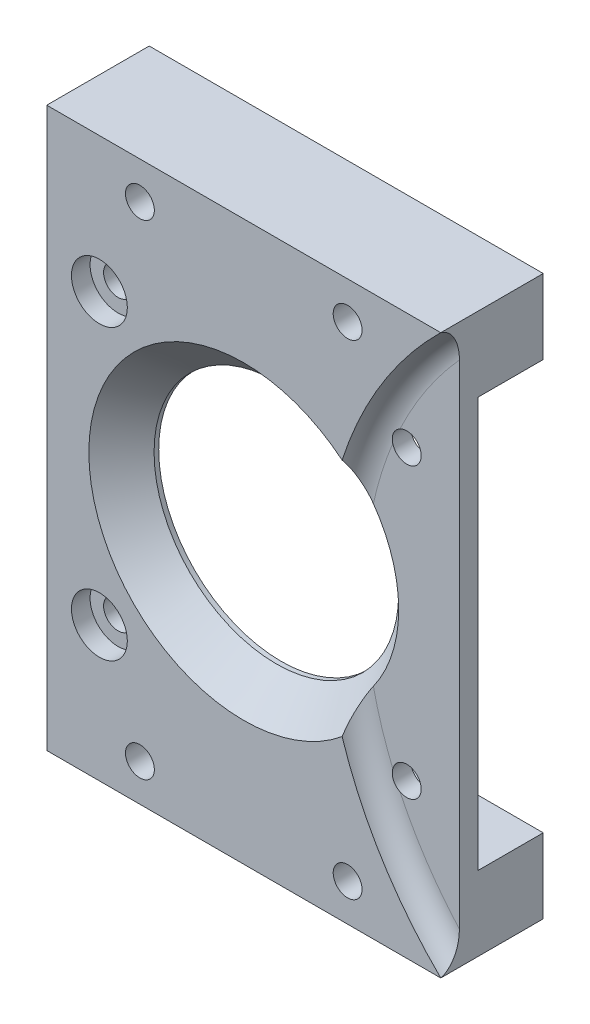
ISO-10303-21;
HEADER;
FILE_DESCRIPTION(('STEP AP214'),'2;1');
FILE_NAME('part.step','',(''),(''),'','','');
FILE_SCHEMA(('AUTOMOTIVE_DESIGN { 1 0 10303 214 1 1 1 1 }'));
ENDSEC;
DATA;
#1=APPLICATION_CONTEXT('core data for automotive mechanical design processes');
#2=APPLICATION_PROTOCOL_DEFINITION('international standard','automotive_design',2000,#1);
#3=PRODUCT_CONTEXT('',#1,'mechanical');
#4=PRODUCT('Part','Part','',(#3));
#5=PRODUCT_RELATED_PRODUCT_CATEGORY('part','',(#4));
#6=PRODUCT_DEFINITION_FORMATION('','',#4);
#7=PRODUCT_DEFINITION_CONTEXT('part definition',#1,'design');
#8=PRODUCT_DEFINITION('design','',#6,#7);
#9=PRODUCT_DEFINITION_SHAPE('','',#8);
#10=(LENGTH_UNIT() NAMED_UNIT(*) SI_UNIT(.MILLI.,.METRE.));
#11=(NAMED_UNIT(*) PLANE_ANGLE_UNIT() SI_UNIT($,.RADIAN.));
#12=(NAMED_UNIT(*) SI_UNIT($,.STERADIAN.) SOLID_ANGLE_UNIT());
#13=UNCERTAINTY_MEASURE_WITH_UNIT(LENGTH_MEASURE(1.E-05),#10,'distance_accuracy_value','');
#14=(GEOMETRIC_REPRESENTATION_CONTEXT(3) GLOBAL_UNCERTAINTY_ASSIGNED_CONTEXT((#13)) GLOBAL_UNIT_ASSIGNED_CONTEXT((#10,
#11,#12)) REPRESENTATION_CONTEXT('',''));
#15=CARTESIAN_POINT('',(0.,0.,0.));
#16=DIRECTION('',(0.,0.,1.));
#17=DIRECTION('',(1.,0.,0.));
#18=AXIS2_PLACEMENT_3D('',#15,#16,#17);
#19=CARTESIAN_POINT('',(0.,0.,4.));
#20=DIRECTION('',(0.,0.,1.));
#21=DIRECTION('',(1.,0.,0.));
#22=AXIS2_PLACEMENT_3D('',#19,#20,#21);
#23=PLANE('',#22);
#24=CARTESIAN_POINT('',(-11.15,26.,4.));
#25=DIRECTION('',(0.,0.,1.));
#26=DIRECTION('',(1.,0.,0.));
#27=AXIS2_PLACEMENT_3D('',#24,#25,#26);
#28=CIRCLE('',#27,1.55);
#29=CARTESIAN_POINT('',(-9.6,26.,4.));
#30=VERTEX_POINT('',#29);
#31=EDGE_CURVE('E438',#30,#30,#28,.F.);
#32=ORIENTED_EDGE('',*,*,#31,.T.);
#33=EDGE_LOOP('',(#32));
#34=FACE_BOUND('',#33,.T.);
#35=CARTESIAN_POINT('',(11.15,-26.,4.));
#36=DIRECTION('',(0.,0.,1.));
#37=DIRECTION('',(1.,0.,0.));
#38=AXIS2_PLACEMENT_3D('',#35,#36,#37);
#39=CIRCLE('',#38,1.55);
#40=CARTESIAN_POINT('',(12.7,-26.,4.));
#41=VERTEX_POINT('',#40);
#42=EDGE_CURVE('E440',#41,#41,#39,.F.);
#43=ORIENTED_EDGE('',*,*,#42,.T.);
#44=EDGE_LOOP('',(#43));
#45=FACE_BOUND('',#44,.T.);
#46=CARTESIAN_POINT('',(-11.15,-26.,4.));
#47=DIRECTION('',(0.,0.,1.));
#48=DIRECTION('',(1.,0.,0.));
#49=AXIS2_PLACEMENT_3D('',#46,#47,#48);
#50=CIRCLE('',#49,1.55);
#51=CARTESIAN_POINT('',(-9.6,-26.,4.));
#52=VERTEX_POINT('',#51);
#53=EDGE_CURVE('E445',#52,#52,#50,.F.);
#54=ORIENTED_EDGE('',*,*,#53,.T.);
#55=EDGE_LOOP('',(#54));
#56=FACE_BOUND('',#55,.T.);
#57=CARTESIAN_POINT('',(11.15,26.,4.));
#58=DIRECTION('',(0.,0.,1.));
#59=DIRECTION('',(1.,0.,0.));
#60=AXIS2_PLACEMENT_3D('',#57,#58,#59);
#61=CIRCLE('',#60,1.55);
#62=CARTESIAN_POINT('',(12.7,26.,4.));
#63=VERTEX_POINT('',#62);
#64=EDGE_CURVE('E439',#63,#63,#61,.F.);
#65=ORIENTED_EDGE('',*,*,#64,.T.);
#66=EDGE_LOOP('',(#65));
#67=FACE_BOUND('',#66,.T.);
#68=CARTESIAN_POINT('',(-15.5000000000036,-15.5000000000003,4.));
#69=DIRECTION('',(0.,0.,1.));
#70=DIRECTION('',(1.,0.,0.));
#71=AXIS2_PLACEMENT_3D('',#68,#69,#70);
#72=CIRCLE('',#71,3.);
#73=CARTESIAN_POINT('',(-12.5000000000036,-15.5000000000003,4.));
#74=VERTEX_POINT('',#73);
#75=EDGE_CURVE('E198',#74,#74,#72,.T.);
#76=ORIENTED_EDGE('',*,*,#75,.F.);
#77=EDGE_LOOP('',(#76));
#78=FACE_BOUND('',#77,.T.);
#79=CARTESIAN_POINT('',(-15.5000000000003,15.5000000000044,4.));
#80=DIRECTION('',(0.,0.,1.));
#81=DIRECTION('',(1.,0.,0.));
#82=AXIS2_PLACEMENT_3D('',#79,#80,#81);
#83=CIRCLE('',#82,3.);
#84=CARTESIAN_POINT('',(-12.5000000000003,15.5000000000044,4.));
#85=VERTEX_POINT('',#84);
#86=EDGE_CURVE('E197',#85,#85,#83,.T.);
#87=ORIENTED_EDGE('',*,*,#86,.F.);
#88=EDGE_LOOP('',(#87));
#89=FACE_BOUND('',#88,.T.);
#90=CARTESIAN_POINT('',(50.5438769133981,0.,4.));
#91=DIRECTION('',(0.,0.,1.));
#92=DIRECTION('',(-1.,0.,0.));
#93=AXIS2_PLACEMENT_3D('',#90,#91,#92);
#94=CIRCLE('',#93,42.);
#95=CARTESIAN_POINT('',(21.15,30.,4.));
#96=VERTEX_POINT('',#95);
#97=CARTESIAN_POINT('',(10.5576465871284,12.8491783509494,4.));
#98=VERTEX_POINT('',#97);
#99=EDGE_CURVE('E214',#96,#98,#94,.T.);
#100=ORIENTED_EDGE('',*,*,#99,.F.);
#101=DIRECTION('',(-1.,0.,0.));
#102=VECTOR('',#101,1.);
#103=CARTESIAN_POINT('',(21.15,30.,4.));
#104=LINE('',#103,#102);
#105=CARTESIAN_POINT('',(-21.15,30.,4.));
#106=VERTEX_POINT('',#105);
#107=EDGE_CURVE('E239',#96,#106,#104,.T.);
#108=ORIENTED_EDGE('',*,*,#107,.T.);
#109=DIRECTION('',(0.,-1.,0.));
#110=VECTOR('',#109,1.);
#111=CARTESIAN_POINT('',(-21.15,-30.,4.));
#112=LINE('',#111,#110);
#113=CARTESIAN_POINT('',(-21.15,-30.,4.));
#114=VERTEX_POINT('',#113);
#115=EDGE_CURVE('E142',#106,#114,#112,.T.);
#116=ORIENTED_EDGE('',*,*,#115,.T.);
#117=DIRECTION('',(1.,0.,0.));
#118=VECTOR('',#117,1.);
#119=CARTESIAN_POINT('',(21.15,-30.,4.));
#120=LINE('',#119,#118);
#121=CARTESIAN_POINT('',(21.15,-30.,4.));
#122=VERTEX_POINT('',#121);
#123=EDGE_CURVE('E242',#114,#122,#120,.T.);
#124=ORIENTED_EDGE('',*,*,#123,.T.);
#125=CARTESIAN_POINT('',(10.5576465871262,-12.8491783509424,4.));
#126=VERTEX_POINT('',#125);
#127=EDGE_CURVE('E217',#126,#122,#94,.T.);
#128=ORIENTED_EDGE('',*,*,#127,.F.);
#129=CARTESIAN_POINT('',(-3.15614118923808E-13,4.44401878829769E-12,4.));
#130=DIRECTION('',(0.,0.,1.));
#131=DIRECTION('',(1.,0.,0.));
#132=AXIS2_PLACEMENT_3D('',#129,#130,#131);
#133=CIRCLE('',#132,16.6302521253619);
#134=EDGE_CURVE('E255',#126,#98,#133,.F.);
#135=ORIENTED_EDGE('',*,*,#134,.T.);
#136=EDGE_LOOP('',(#100,#108,#116,#124,#128,#135));
#137=FACE_BOUND('',#136,.T.);
#138=ADVANCED_FACE('F36',(#34,#45,#56,#67,#78,#89,#137),#23,.T.);
#139=CARTESIAN_POINT('',(0.,0.,0.));
#140=DIRECTION('',(0.,0.,1.));
#141=DIRECTION('',(1.,0.,0.));
#142=AXIS2_PLACEMENT_3D('',#139,#140,#141);
#143=PLANE('',#142);
#144=DIRECTION('',(-1.,0.,0.));
#145=VECTOR('',#144,1.);
#146=CARTESIAN_POINT('',(-21.15,22.,0.));
#147=LINE('',#146,#145);
#148=CARTESIAN_POINT('',(21.15,22.,0.));
#149=VERTEX_POINT('',#148);
#150=CARTESIAN_POINT('',(-21.15,22.,0.));
#151=VERTEX_POINT('',#150);
#152=EDGE_CURVE('E159',#149,#151,#147,.T.);
#153=ORIENTED_EDGE('',*,*,#152,.F.);
#154=DIRECTION('',(0.,1.,0.));
#155=VECTOR('',#154,1.);
#156=CARTESIAN_POINT('',(21.15,-30.,0.));
#157=LINE('',#156,#155);
#158=CARTESIAN_POINT('',(21.15,-22.,0.));
#159=VERTEX_POINT('',#158);
#160=EDGE_CURVE('E238',#159,#149,#157,.T.);
#161=ORIENTED_EDGE('',*,*,#160,.F.);
#162=DIRECTION('',(1.,0.,0.));
#163=VECTOR('',#162,1.);
#164=CARTESIAN_POINT('',(-21.15,-22.,0.));
#165=LINE('',#164,#163);
#166=CARTESIAN_POINT('',(-21.15,-22.,0.));
#167=VERTEX_POINT('',#166);
#168=EDGE_CURVE('E177',#167,#159,#165,.T.);
#169=ORIENTED_EDGE('',*,*,#168,.F.);
#170=DIRECTION('',(0.,-1.,0.));
#171=VECTOR('',#170,1.);
#172=CARTESIAN_POINT('',(-21.15,-30.,0.));
#173=LINE('',#172,#171);
#174=EDGE_CURVE('E62',#151,#167,#173,.T.);
#175=ORIENTED_EDGE('',*,*,#174,.F.);
#176=EDGE_LOOP('',(#153,#161,#169,#175));
#177=FACE_BOUND('',#176,.T.);
#178=CARTESIAN_POINT('',(-3.15614118923808E-13,4.44401878829769E-12,0.));
#179=DIRECTION('',(0.,0.,1.));
#180=DIRECTION('',(1.,0.,0.));
#181=AXIS2_PLACEMENT_3D('',#178,#179,#180);
#182=CIRCLE('',#181,13.1302521253619);
#183=CARTESIAN_POINT('',(13.1302521253616,4.44401878829769E-12,0.));
#184=VERTEX_POINT('',#183);
#185=EDGE_CURVE('E235',#184,#184,#182,.T.);
#186=ORIENTED_EDGE('',*,*,#185,.T.);
#187=EDGE_LOOP('',(#186));
#188=FACE_BOUND('',#187,.T.);
#189=CARTESIAN_POINT('',(-15.5000000000003,15.5000000000044,0.));
#190=DIRECTION('',(0.,0.,1.));
#191=DIRECTION('',(1.,0.,0.));
#192=AXIS2_PLACEMENT_3D('',#189,#190,#191);
#193=CIRCLE('',#192,1.55);
#194=CARTESIAN_POINT('',(-13.9500000000003,15.5000000000044,0.));
#195=VERTEX_POINT('',#194);
#196=EDGE_CURVE('E232',#195,#195,#193,.T.);
#197=ORIENTED_EDGE('',*,*,#196,.T.);
#198=EDGE_LOOP('',(#197));
#199=FACE_BOUND('',#198,.T.);
#200=CARTESIAN_POINT('',(15.5000000000044,15.5000000000012,0.));
#201=DIRECTION('',(0.,0.,1.));
#202=DIRECTION('',(1.,0.,0.));
#203=AXIS2_PLACEMENT_3D('',#200,#201,#202);
#204=CIRCLE('',#203,1.5500000000009);
#205=CARTESIAN_POINT('',(17.0500000000053,15.5000000000012,0.));
#206=VERTEX_POINT('',#205);
#207=EDGE_CURVE('E229',#206,#206,#204,.T.);
#208=ORIENTED_EDGE('',*,*,#207,.T.);
#209=EDGE_LOOP('',(#208));
#210=FACE_BOUND('',#209,.T.);
#211=CARTESIAN_POINT('',(15.5000000000012,-15.5000000000036,0.));
#212=DIRECTION('',(0.,0.,1.));
#213=DIRECTION('',(1.,0.,0.));
#214=AXIS2_PLACEMENT_3D('',#211,#212,#213);
#215=CIRCLE('',#214,1.55000000000123);
#216=CARTESIAN_POINT('',(17.0500000000024,-15.5000000000036,0.));
#217=VERTEX_POINT('',#216);
#218=EDGE_CURVE('E226',#217,#217,#215,.T.);
#219=ORIENTED_EDGE('',*,*,#218,.T.);
#220=EDGE_LOOP('',(#219));
#221=FACE_BOUND('',#220,.T.);
#222=CARTESIAN_POINT('',(-15.5000000000036,-15.5000000000003,0.));
#223=DIRECTION('',(0.,0.,1.));
#224=DIRECTION('',(1.,0.,0.));
#225=AXIS2_PLACEMENT_3D('',#222,#223,#224);
#226=CIRCLE('',#225,1.55000000000047);
#227=CARTESIAN_POINT('',(-13.9500000000031,-15.5000000000003,0.));
#228=VERTEX_POINT('',#227);
#229=EDGE_CURVE('E223',#228,#228,#226,.T.);
#230=ORIENTED_EDGE('',*,*,#229,.T.);
#231=EDGE_LOOP('',(#230));
#232=FACE_BOUND('',#231,.T.);
#233=ADVANCED_FACE('F311',(#177,#188,#199,#210,#221,#232),#143,.F.);
#234=CARTESIAN_POINT('',(21.15,-30.,4.));
#235=DIRECTION('',(-1.,0.,0.));
#236=DIRECTION('',(0.,0.,1.));
#237=AXIS2_PLACEMENT_3D('',#234,#235,#236);
#238=PLANE('',#237);
#239=DIRECTION('',(0.,0.,-1.));
#240=VECTOR('',#239,1.);
#241=CARTESIAN_POINT('',(21.15,30.,4.));
#242=LINE('',#241,#240);
#243=CARTESIAN_POINT('',(21.15,30.,-7.));
#244=VERTEX_POINT('',#243);
#245=EDGE_CURVE('E145',#96,#244,#242,.T.);
#246=ORIENTED_EDGE('',*,*,#245,.F.);
#247=CARTESIAN_POINT('',(21.15,30.,4.));
#248=CARTESIAN_POINT('',(21.15,29.9823229246285,3.93808051762968));
#249=CARTESIAN_POINT('',(21.15,29.9614519797545,3.87711289801731));
#250=CARTESIAN_POINT('',(21.15,29.9138927214578,3.75758819217407));
#251=CARTESIAN_POINT('',(21.15,29.8872129958025,3.69902769756867));
#252=CARTESIAN_POINT('',(21.15,29.8288354675369,3.5851935156425));
#253=CARTESIAN_POINT('',(21.15,29.7971887532433,3.52989349408233));
#254=CARTESIAN_POINT('',(21.15,29.7292500656117,3.42222196069885));
#255=CARTESIAN_POINT('',(21.15,29.6929564438008,3.36985149764476));
#256=CARTESIAN_POINT('',(21.15,29.5783762256451,3.21802631230102));
#257=CARTESIAN_POINT('',(21.15,29.4939943144953,3.12310881008613));
#258=CARTESIAN_POINT('',(21.15,29.3127351838226,2.94589842983991));
#259=CARTESIAN_POINT('',(21.15,29.2158271101888,2.86363786202568));
#260=CARTESIAN_POINT('',(21.15,28.9542880885123,2.66786739355103));
#261=CARTESIAN_POINT('',(21.15,28.7827440665546,2.56356818827994));
#262=CARTESIAN_POINT('',(21.15,28.4248783337179,2.38321884880126));
#263=CARTESIAN_POINT('',(21.15,28.2384942159164,2.30729658348841));
#264=CARTESIAN_POINT('',(21.15,27.9196015228708,2.20207977540903));
#265=CARTESIAN_POINT('',(21.15,27.7893662471128,2.16565453540405));
#266=CARTESIAN_POINT('',(21.15,27.5261982961067,2.10390846617076));
#267=CARTESIAN_POINT('',(21.15,27.3932639005264,2.07859496749764));
#268=CARTESIAN_POINT('',(21.15,27.1275309030053,2.03877827250907));
#269=CARTESIAN_POINT('',(21.15,26.9947518010082,2.02414254928157));
#270=CARTESIAN_POINT('',(21.15,26.7286714674518,2.00477248258794));
#271=CARTESIAN_POINT('',(21.15,26.5953713421445,2.00002306069268));
#272=CARTESIAN_POINT('',(21.15,26.4621023655758,2.));
#273=B_SPLINE_CURVE_WITH_KNOTS('',3,(#247,#248,#249,#250,#251,#252,#253,#254,#255,#256,#257,
#258,#259,#260,#261,#262,#263,#264,#265,#266,#267,#268,#269,#270,#271,#272),.UNSPECIFIED.,.F.,
.F.,(4,2,2,2,2,2,2,2,2,2,2,2,4),(0.,0.193038288369215,0.385793101529734,0.57668158219881,
0.767637968435765,1.14704015775366,1.52739535376786,2.12634464200897,2.72796120765596,
3.13319700009996,3.53869973136802,3.93907973819243,4.33884864304363),.UNSPECIFIED.);
#274=CARTESIAN_POINT('',(21.15,26.4621023655758,2.));
#275=VERTEX_POINT('',#274);
#276=EDGE_CURVE('E331',#96,#275,#273,.T.);
#277=ORIENTED_EDGE('',*,*,#276,.T.);
#278=DIRECTION('',(0.,1.,0.));
#279=VECTOR('',#278,1.);
#280=CARTESIAN_POINT('',(21.15,-30.,2.));
#281=LINE('',#280,#279);
#282=CARTESIAN_POINT('',(21.15,-26.4621023655758,2.));
#283=VERTEX_POINT('',#282);
#284=EDGE_CURVE('E210',#283,#275,#281,.T.);
#285=ORIENTED_EDGE('',*,*,#284,.F.);
#286=CARTESIAN_POINT('',(21.15,-26.4621023655758,2.));
#287=CARTESIAN_POINT('',(21.15,-26.6076180690685,2.00003266519487));
#288=CARTESIAN_POINT('',(21.15,-26.7531827747909,2.00569071000889));
#289=CARTESIAN_POINT('',(21.15,-27.043695277469,2.02882897700386));
#290=CARTESIAN_POINT('',(21.15,-27.1886409101826,2.04633613342165));
#291=CARTESIAN_POINT('',(21.15,-27.4781505052372,2.09401631253907));
#292=CARTESIAN_POINT('',(21.15,-27.6226917244496,2.12432996261918));
#293=CARTESIAN_POINT('',(21.15,-27.9081468204618,2.19839559526637));
#294=CARTESIAN_POINT('',(21.15,-28.0490643872398,2.24213326904247));
#295=CARTESIAN_POINT('',(21.15,-28.358383995256,2.35606798842214));
#296=CARTESIAN_POINT('',(21.15,-28.525416365476,2.43007454178752));
#297=CARTESIAN_POINT('',(21.15,-28.8463548271292,2.60197947684616));
#298=CARTESIAN_POINT('',(21.15,-29.0003000826267,2.699802926));
#299=CARTESIAN_POINT('',(21.15,-29.2559250318991,2.8961066027681));
#300=CARTESIAN_POINT('',(21.15,-29.3615466393766,2.98942337515758));
#301=CARTESIAN_POINT('',(21.15,-29.5564090611133,3.1915458602483));
#302=CARTESIAN_POINT('',(21.15,-29.6457016777984,3.30030057584449));
#303=CARTESIAN_POINT('',(21.15,-29.7845425902232,3.50557085766032));
#304=CARTESIAN_POINT('',(21.15,-29.8385056315661,3.59907568156235));
#305=CARTESIAN_POINT('',(21.15,-29.908070725877,3.74513017524816));
#306=CARTESIAN_POINT('',(21.15,-29.9294210011731,3.79497948606929));
#307=CARTESIAN_POINT('',(21.15,-29.967935470263,3.89632536105212));
#308=CARTESIAN_POINT('',(21.15,-29.9850953648122,3.94782355619028));
#309=CARTESIAN_POINT('',(21.15,-30.,4.));
#310=B_SPLINE_CURVE_WITH_KNOTS('',3,(#286,#287,#288,#289,#290,#291,#292,#293,#294,#295,#296,
#297,#298,#299,#300,#301,#302,#303,#304,#305,#306,#307,#308,#309),.UNSPECIFIED.,.F.,.F.,(4,2,2,
2,2,2,2,2,2,2,2,4),(0.,0.436512043591912,0.874019670831838,1.31646181333594,1.75843398094273,
2.30479602602032,2.84946083361362,3.27080592012575,3.69079021221825,4.013375393582,
4.17589338118165,4.33857741487711),.UNSPECIFIED.);
#311=EDGE_CURVE('E50',#283,#122,#310,.T.);
#312=ORIENTED_EDGE('',*,*,#311,.T.);
#313=DIRECTION('',(0.,0.,-1.));
#314=VECTOR('',#313,1.);
#315=CARTESIAN_POINT('',(21.15,-30.,4.));
#316=LINE('',#315,#314);
#317=CARTESIAN_POINT('',(21.15,-30.,-7.));
#318=VERTEX_POINT('',#317);
#319=EDGE_CURVE('E245',#122,#318,#316,.T.);
#320=ORIENTED_EDGE('',*,*,#319,.T.);
#321=DIRECTION('',(0.,-1.,0.));
#322=VECTOR('',#321,1.);
#323=CARTESIAN_POINT('',(21.15,-30.,-7.));
#324=LINE('',#323,#322);
#325=CARTESIAN_POINT('',(21.15,-22.,-7.));
#326=VERTEX_POINT('',#325);
#327=EDGE_CURVE('E183',#326,#318,#324,.T.);
#328=ORIENTED_EDGE('',*,*,#327,.F.);
#329=DIRECTION('',(0.,0.,1.));
#330=VECTOR('',#329,1.);
#331=CARTESIAN_POINT('',(21.15,-22.,-7.));
#332=LINE('',#331,#330);
#333=EDGE_CURVE('E189',#326,#159,#332,.T.);
#334=ORIENTED_EDGE('',*,*,#333,.T.);
#335=ORIENTED_EDGE('',*,*,#160,.T.);
#336=DIRECTION('',(0.,0.,1.));
#337=VECTOR('',#336,1.);
#338=CARTESIAN_POINT('',(21.15,22.,-7.));
#339=LINE('',#338,#337);
#340=CARTESIAN_POINT('',(21.15,22.,-7.));
#341=VERTEX_POINT('',#340);
#342=EDGE_CURVE('E169',#341,#149,#339,.T.);
#343=ORIENTED_EDGE('',*,*,#342,.F.);
#344=DIRECTION('',(0.,-1.,0.));
#345=VECTOR('',#344,1.);
#346=CARTESIAN_POINT('',(21.15,30.,-7.));
#347=LINE('',#346,#345);
#348=EDGE_CURVE('E153',#244,#341,#347,.T.);
#349=ORIENTED_EDGE('',*,*,#348,.F.);
#350=EDGE_LOOP('',(#246,#277,#285,#312,#320,#328,#334,#335,#343,#349));
#351=FACE_BOUND('',#350,.T.);
#352=ADVANCED_FACE('F315',(#351),#238,.F.);
#353=CARTESIAN_POINT('',(21.15,30.,4.));
#354=DIRECTION('',(0.,-1.,0.));
#355=DIRECTION('',(0.,0.,-1.));
#356=AXIS2_PLACEMENT_3D('',#353,#354,#355);
#357=PLANE('',#356);
#358=ORIENTED_EDGE('',*,*,#245,.T.);
#359=DIRECTION('',(1.,0.,0.));
#360=VECTOR('',#359,1.);
#361=CARTESIAN_POINT('',(-21.15,30.,-7.));
#362=LINE('',#361,#360);
#363=CARTESIAN_POINT('',(-21.15,30.,-7.));
#364=VERTEX_POINT('',#363);
#365=EDGE_CURVE('E149',#364,#244,#362,.T.);
#366=ORIENTED_EDGE('',*,*,#365,.F.);
#367=DIRECTION('',(0.,0.,-1.));
#368=VECTOR('',#367,1.);
#369=CARTESIAN_POINT('',(-21.15,30.,4.));
#370=LINE('',#369,#368);
#371=EDGE_CURVE('E136',#106,#364,#370,.T.);
#372=ORIENTED_EDGE('',*,*,#371,.F.);
#373=ORIENTED_EDGE('',*,*,#107,.F.);
#374=EDGE_LOOP('',(#358,#366,#372,#373));
#375=FACE_BOUND('',#374,.T.);
#376=ADVANCED_FACE('F150',(#375),#357,.F.);
#377=CARTESIAN_POINT('',(-21.15,-30.,4.));
#378=DIRECTION('',(1.,0.,0.));
#379=DIRECTION('',(0.,0.,-1.));
#380=AXIS2_PLACEMENT_3D('',#377,#378,#379);
#381=PLANE('',#380);
#382=ORIENTED_EDGE('',*,*,#371,.T.);
#383=DIRECTION('',(0.,1.,0.));
#384=VECTOR('',#383,1.);
#385=CARTESIAN_POINT('',(-21.15,30.,-7.));
#386=LINE('',#385,#384);
#387=CARTESIAN_POINT('',(-21.15,22.,-7.));
#388=VERTEX_POINT('',#387);
#389=EDGE_CURVE('E140',#388,#364,#386,.T.);
#390=ORIENTED_EDGE('',*,*,#389,.F.);
#391=DIRECTION('',(0.,0.,1.));
#392=VECTOR('',#391,1.);
#393=CARTESIAN_POINT('',(-21.15,22.,-7.));
#394=LINE('',#393,#392);
#395=EDGE_CURVE('E57',#388,#151,#394,.T.);
#396=ORIENTED_EDGE('',*,*,#395,.T.);
#397=ORIENTED_EDGE('',*,*,#174,.T.);
#398=DIRECTION('',(0.,0.,1.));
#399=VECTOR('',#398,1.);
#400=CARTESIAN_POINT('',(-21.15,-22.,-7.));
#401=LINE('',#400,#399);
#402=CARTESIAN_POINT('',(-21.15,-22.,-7.));
#403=VERTEX_POINT('',#402);
#404=EDGE_CURVE('E194',#403,#167,#401,.T.);
#405=ORIENTED_EDGE('',*,*,#404,.F.);
#406=DIRECTION('',(0.,1.,0.));
#407=VECTOR('',#406,1.);
#408=CARTESIAN_POINT('',(-21.15,-30.,-7.));
#409=LINE('',#408,#407);
#410=CARTESIAN_POINT('',(-21.15,-30.,-7.));
#411=VERTEX_POINT('',#410);
#412=EDGE_CURVE('E178',#411,#403,#409,.T.);
#413=ORIENTED_EDGE('',*,*,#412,.F.);
#414=DIRECTION('',(0.,0.,-1.));
#415=VECTOR('',#414,1.);
#416=CARTESIAN_POINT('',(-21.15,-30.,4.));
#417=LINE('',#416,#415);
#418=EDGE_CURVE('E146',#114,#411,#417,.T.);
#419=ORIENTED_EDGE('',*,*,#418,.F.);
#420=ORIENTED_EDGE('',*,*,#115,.F.);
#421=EDGE_LOOP('',(#382,#390,#396,#397,#405,#413,#419,#420));
#422=FACE_BOUND('',#421,.T.);
#423=ADVANCED_FACE('F138',(#422),#381,.F.);
#424=CARTESIAN_POINT('',(21.15,-30.,4.));
#425=DIRECTION('',(0.,1.,0.));
#426=DIRECTION('',(0.,0.,1.));
#427=AXIS2_PLACEMENT_3D('',#424,#425,#426);
#428=PLANE('',#427);
#429=ORIENTED_EDGE('',*,*,#418,.T.);
#430=DIRECTION('',(-1.,0.,0.));
#431=VECTOR('',#430,1.);
#432=CARTESIAN_POINT('',(-21.15,-30.,-7.));
#433=LINE('',#432,#431);
#434=EDGE_CURVE('E186',#318,#411,#433,.T.);
#435=ORIENTED_EDGE('',*,*,#434,.F.);
#436=ORIENTED_EDGE('',*,*,#319,.F.);
#437=ORIENTED_EDGE('',*,*,#123,.F.);
#438=EDGE_LOOP('',(#429,#435,#436,#437));
#439=FACE_BOUND('',#438,.T.);
#440=ADVANCED_FACE('F307',(#439),#428,.F.);
#441=CARTESIAN_POINT('',(-3.15614118923808E-13,4.44401878829769E-12,4.));
#442=DIRECTION('',(0.,0.,-1.));
#443=DIRECTION('',(-1.,0.,0.));
#444=AXIS2_PLACEMENT_3D('',#441,#442,#443);
#445=CYLINDRICAL_SURFACE('',#444,13.1302521253619);
#446=CARTESIAN_POINT('',(-3.15614118923808E-13,4.44401878829769E-12,0.500000000000023));
#447=DIRECTION('',(0.,0.,1.));
#448=DIRECTION('',(1.,0.,0.));
#449=AXIS2_PLACEMENT_3D('',#446,#447,#448);
#450=CIRCLE('',#449,13.1302521253619);
#451=CARTESIAN_POINT('',(13.1302521253616,4.44401878829769E-12,0.500000000000023));
#452=VERTEX_POINT('',#451);
#453=EDGE_CURVE('E252',#452,#452,#450,.T.);
#454=ORIENTED_EDGE('',*,*,#453,.T.);
#455=EDGE_LOOP('',(#454));
#456=FACE_BOUND('',#455,.T.);
#457=ORIENTED_EDGE('',*,*,#185,.F.);
#458=EDGE_LOOP('',(#457));
#459=FACE_BOUND('',#458,.T.);
#460=ADVANCED_FACE('F303',(#456,#459),#445,.F.);
#461=CARTESIAN_POINT('',(-15.5000000000003,15.5000000000044,4.));
#462=DIRECTION('',(0.,0.,-1.));
#463=DIRECTION('',(-1.,0.,0.));
#464=AXIS2_PLACEMENT_3D('',#461,#462,#463);
#465=CYLINDRICAL_SURFACE('',#464,1.55);
#466=CARTESIAN_POINT('',(-15.5000000000003,15.5000000000044,2.));
#467=DIRECTION('',(0.,0.,-1.));
#468=DIRECTION('',(-1.,0.,0.));
#469=AXIS2_PLACEMENT_3D('',#466,#467,#468);
#470=CIRCLE('',#469,1.55);
#471=CARTESIAN_POINT('',(-17.0500000000003,15.5000000000044,2.));
#472=VERTEX_POINT('',#471);
#473=EDGE_CURVE('E264',#472,#472,#470,.T.);
#474=ORIENTED_EDGE('',*,*,#473,.F.);
#475=EDGE_LOOP('',(#474));
#476=FACE_BOUND('',#475,.T.);
#477=ORIENTED_EDGE('',*,*,#196,.F.);
#478=EDGE_LOOP('',(#477));
#479=FACE_BOUND('',#478,.T.);
#480=ADVANCED_FACE('F297',(#476,#479),#465,.F.);
#481=CARTESIAN_POINT('',(15.5000000000044,15.5000000000012,4.));
#482=DIRECTION('',(0.,0.,-1.));
#483=DIRECTION('',(-1.,0.,0.));
#484=AXIS2_PLACEMENT_3D('',#481,#482,#483);
#485=CYLINDRICAL_SURFACE('',#484,1.5500000000009);
#486=CARTESIAN_POINT('',(15.5000000000044,15.5000000000012,2.));
#487=DIRECTION('',(0.,0.,-1.));
#488=DIRECTION('',(-1.,0.,0.));
#489=AXIS2_PLACEMENT_3D('',#486,#487,#488);
#490=CIRCLE('',#489,1.5500000000009);
#491=CARTESIAN_POINT('',(14.7706412374714,16.8676753253321,2.));
#492=VERTEX_POINT('',#491);
#493=CARTESIAN_POINT('',(13.9974251984287,15.1195148285789,2.));
#494=VERTEX_POINT('',#493);
#495=EDGE_CURVE('E220',#492,#494,#490,.T.);
#496=ORIENTED_EDGE('',*,*,#495,.F.);
#497=CARTESIAN_POINT('',(14.7706412374714,16.8676753253321,2.));
#498=CARTESIAN_POINT('',(14.73222892417,16.8471905843288,2.00000214555736));
#499=CARTESIAN_POINT('',(14.6947017538101,16.8250983683323,2.00040542377009));
#500=CARTESIAN_POINT('',(14.6216485110969,16.7778468037872,2.00176403021501));
#501=CARTESIAN_POINT('',(14.5861221469828,16.7526879041293,2.0027192777282));
#502=CARTESIAN_POINT('',(14.4829441643348,16.6728774919028,2.00603573336363));
#503=CARTESIAN_POINT('',(14.4186142998448,16.6138498385378,2.00884868103709));
#504=CARTESIAN_POINT('',(14.3007631081184,16.4858550448829,2.01402312565361));
#505=CARTESIAN_POINT('',(14.2472442402507,16.4168856490699,2.01638451986729));
#506=CARTESIAN_POINT('',(14.1525283682417,16.2709583962913,2.01958324238614));
#507=CARTESIAN_POINT('',(14.1113240220957,16.194005336262,2.02042148032844));
#508=CARTESIAN_POINT('',(14.042470571497,16.0344550068408,2.02022816245634));
#509=CARTESIAN_POINT('',(14.0147929530364,15.9518700321131,2.01920056154912));
#510=CARTESIAN_POINT('',(13.9736249794881,15.7832309514423,2.01570969016568));
#511=CARTESIAN_POINT('',(13.9601419478425,15.6971750785004,2.01324567961725));
#512=CARTESIAN_POINT('',(13.948063943968,15.5282757360444,2.00814464762058));
#513=CARTESIAN_POINT('',(13.9487678512213,15.4454830178141,2.0055221415883));
#514=CARTESIAN_POINT('',(13.9596743588951,15.3222244099437,2.00246936442408));
#515=CARTESIAN_POINT('',(13.9649541800065,15.2812832000955,2.00159849522023));
#516=CARTESIAN_POINT('',(13.9787624130581,15.1999377177035,2.00036466120469));
#517=CARTESIAN_POINT('',(13.9872913862843,15.1595335391797,2.00000178419851));
#518=CARTESIAN_POINT('',(13.9974251984287,15.1195148285789,2.));
#519=B_SPLINE_CURVE_WITH_KNOTS('',3,(#497,#498,#499,#500,#501,#502,#503,#504,#505,#506,#507,
#508,#509,#510,#511,#512,#513,#514,#515,#516,#517,#518),.UNSPECIFIED.,.F.,.F.,(4,2,2,2,2,2,2,2,
2,2,4),(0.,0.130512196916279,0.261005312790058,0.52172503087405,0.782503992859677,
1.04312716499407,1.30319855450854,1.56340405752658,1.81078316484203,1.93453440522508,
2.05830703314257),.UNSPECIFIED.);
#520=EDGE_CURVE('E276',#492,#494,#519,.T.);
#521=ORIENTED_EDGE('',*,*,#520,.T.);
#522=EDGE_LOOP('',(#496,#521));
#523=FACE_BOUND('',#522,.T.);
#524=ORIENTED_EDGE('',*,*,#207,.F.);
#525=EDGE_LOOP('',(#524));
#526=FACE_BOUND('',#525,.T.);
#527=ADVANCED_FACE('F291',(#523,#526),#485,.F.);
#528=CARTESIAN_POINT('',(15.5000000000012,-15.5000000000036,4.));
#529=DIRECTION('',(0.,0.,-1.));
#530=DIRECTION('',(-1.,0.,0.));
#531=AXIS2_PLACEMENT_3D('',#528,#529,#530);
#532=CYLINDRICAL_SURFACE('',#531,1.55000000000123);
#533=CARTESIAN_POINT('',(15.5000000000012,-15.5000000000036,2.));
#534=DIRECTION('',(0.,0.,-1.));
#535=DIRECTION('',(-1.,0.,0.));
#536=AXIS2_PLACEMENT_3D('',#533,#534,#535);
#537=CIRCLE('',#536,1.55000000000123);
#538=CARTESIAN_POINT('',(13.9974251984268,-15.1195148285744,2.));
#539=VERTEX_POINT('',#538);
#540=CARTESIAN_POINT('',(14.7706412374743,-16.8676753253381,2.));
#541=VERTEX_POINT('',#540);
#542=EDGE_CURVE('E213',#539,#541,#537,.T.);
#543=ORIENTED_EDGE('',*,*,#542,.F.);
#544=CARTESIAN_POINT('',(13.9974251984268,-15.1195148285744,2.));
#545=CARTESIAN_POINT('',(13.9867390155356,-15.16171596508,2.00000214555736));
#546=CARTESIAN_POINT('',(13.9778376314303,-15.2043436542488,2.0004054237701));
#547=CARTESIAN_POINT('',(13.96365037617,-15.290181923168,2.00176403021504));
#548=CARTESIAN_POINT('',(13.9583639766129,-15.333392416788,2.00271927772824));
#549=CARTESIAN_POINT('',(13.9479992551531,-15.463423069144,2.00603573336372));
#550=CARTESIAN_POINT('',(13.9483934141025,-15.5507296551832,2.00884868103723));
#551=CARTESIAN_POINT('',(13.9638071130403,-15.7240328244536,2.01402312565386));
#552=CARTESIAN_POINT('',(13.9788299763651,-15.810029105502,2.01638451986762));
#553=CARTESIAN_POINT('',(14.0230756889451,-15.9782794440819,2.01958324238659));
#554=CARTESIAN_POINT('',(14.05229004974,-16.0605357065337,2.02042148032895));
#555=CARTESIAN_POINT('',(14.1240140911739,-16.2188163659908,2.02022816245694));
#556=CARTESIAN_POINT('',(14.1664954924583,-16.2948535881871,2.01920056154976));
#557=CARTESIAN_POINT('',(14.2635695482972,-16.4387652599118,2.01570969016634));
#558=CARTESIAN_POINT('',(14.3181684370807,-16.5066354798447,2.0132456796179));
#559=CARTESIAN_POINT('',(14.4350055028565,-16.6291996104923,2.00814464762108));
#560=CARTESIAN_POINT('',(14.4967344477478,-16.6843781121064,2.00552214158865));
#561=CARTESIAN_POINT('',(14.595266525507,-16.7592317424601,2.00246936442425));
#562=CARTESIAN_POINT('',(14.629109501595,-16.7828688350141,2.00159849522034));
#563=CARTESIAN_POINT('',(14.698583701916,-16.8273782755379,2.00036466120471));
#564=CARTESIAN_POINT('',(14.7342152341954,-16.8482501449797,2.00000178419851));
#565=CARTESIAN_POINT('',(14.7706412374743,-16.8676753253381,2.));
#566=B_SPLINE_CURVE_WITH_KNOTS('',3,(#544,#545,#546,#547,#548,#549,#550,#551,#552,#553,#554,
#555,#556,#557,#558,#559,#560,#561,#562,#563,#564,#565),.UNSPECIFIED.,.F.,.F.,(4,2,2,2,2,2,2,2,
2,2,4),(0.,0.130512196916296,0.261005312790095,0.521725030874131,0.7825039928598,
1.04312716499423,1.30319855450875,1.56340405752684,1.81078316484937,1.93453440523599,
2.05830703315705),.UNSPECIFIED.);
#567=EDGE_CURVE('E342',#539,#541,#566,.T.);
#568=ORIENTED_EDGE('',*,*,#567,.T.);
#569=EDGE_LOOP('',(#543,#568));
#570=FACE_BOUND('',#569,.T.);
#571=ORIENTED_EDGE('',*,*,#218,.F.);
#572=EDGE_LOOP('',(#571));
#573=FACE_BOUND('',#572,.T.);
#574=ADVANCED_FACE('F296',(#570,#573),#532,.F.);
#575=CARTESIAN_POINT('',(-15.5000000000036,-15.5000000000003,4.));
#576=DIRECTION('',(0.,0.,-1.));
#577=DIRECTION('',(-1.,0.,0.));
#578=AXIS2_PLACEMENT_3D('',#575,#576,#577);
#579=CYLINDRICAL_SURFACE('',#578,1.55000000000047);
#580=CARTESIAN_POINT('',(-15.5000000000036,-15.5000000000003,2.));
#581=DIRECTION('',(0.,0.,-1.));
#582=DIRECTION('',(-1.,0.,0.));
#583=AXIS2_PLACEMENT_3D('',#580,#581,#582);
#584=CIRCLE('',#583,1.55000000000047);
#585=CARTESIAN_POINT('',(-17.050000000004,-15.5000000000003,2.));
#586=VERTEX_POINT('',#585);
#587=EDGE_CURVE('E205',#586,#586,#584,.T.);
#588=ORIENTED_EDGE('',*,*,#587,.F.);
#589=EDGE_LOOP('',(#588));
#590=FACE_BOUND('',#589,.T.);
#591=ORIENTED_EDGE('',*,*,#229,.F.);
#592=EDGE_LOOP('',(#591));
#593=FACE_BOUND('',#592,.T.);
#594=ADVANCED_FACE('F374',(#590,#593),#579,.F.);
#595=CARTESIAN_POINT('',(-3.15614118923808E-13,4.44401878829769E-12,0.500000000000023));
#596=DIRECTION('',(0.,0.,1.));
#597=DIRECTION('',(1.,0.,0.));
#598=AXIS2_PLACEMENT_3D('',#595,#596,#597);
#599=CONICAL_SURFACE('',#598,13.1302521253619,0.78539816339745);
#600=CARTESIAN_POINT('',(-3.15614118923808E-13,4.44401878829769E-12,2.));
#601=DIRECTION('',(0.,0.,-1.));
#602=DIRECTION('',(-1.,0.,0.));
#603=AXIS2_PLACEMENT_3D('',#600,#601,#602);
#604=CIRCLE('',#603,14.6302521253619);
#605=CARTESIAN_POINT('',(11.9152406051678,8.48948282127266,2.));
#606=VERTEX_POINT('',#605);
#607=CARTESIAN_POINT('',(11.9152406051663,-8.48948282126587,2.));
#608=VERTEX_POINT('',#607);
#609=EDGE_CURVE('E258',#606,#608,#604,.T.);
#610=ORIENTED_EDGE('',*,*,#609,.F.);
#611=CARTESIAN_POINT('',(11.9152406051678,8.48948282127267,2.));
#612=CARTESIAN_POINT('',(11.853809725817,8.57577565845728,2.0000323742198));
#613=CARTESIAN_POINT('',(11.7944259237381,8.66344182176396,2.00369881801794));
#614=CARTESIAN_POINT('',(11.6796798436123,8.84072034179378,2.01769124228656));
#615=CARTESIAN_POINT('',(11.6243131117973,8.93033039549944,2.0280097180584));
#616=CARTESIAN_POINT('',(11.5175366589241,9.11064743816656,2.05466397780486));
#617=CARTESIAN_POINT('',(11.4661165537688,9.20135076720023,2.0709832674296));
#618=CARTESIAN_POINT('',(11.3670304346075,9.38365244519216,2.1092146773446));
#619=CARTESIAN_POINT('',(11.3193662606719,9.47525120843524,2.13112951693465));
#620=CARTESIAN_POINT('',(11.1400402509102,9.83501645961038,2.22720051678089));
#621=CARTESIAN_POINT('',(11.0224005633894,10.1052511341602,2.32100565006137));
#622=CARTESIAN_POINT('',(10.8214958531568,10.643801469548,2.54620144740637));
#623=CARTESIAN_POINT('',(10.7383560064309,10.9121067303825,2.67772610157769));
#624=CARTESIAN_POINT('',(10.6390887366916,11.3233224159919,2.90653022480004));
#625=CARTESIAN_POINT('',(10.6095919746134,11.4691103573774,2.9931557225351));
#626=CARTESIAN_POINT('',(10.563264521012,11.7573213751649,3.17494138279552));
#627=CARTESIAN_POINT('',(10.5464298760139,11.8997454883865,3.27009887099511));
#628=CARTESIAN_POINT('',(10.5261389774817,12.179793937611,3.46748084028284));
#629=CARTESIAN_POINT('',(10.5226324369225,12.3174343697452,3.56967727361104));
#630=CARTESIAN_POINT('',(10.5295312117045,12.5874932936724,3.78038449787162));
#631=CARTESIAN_POINT('',(10.5399409889698,12.7199100966209,3.8888973033218));
#632=CARTESIAN_POINT('',(10.5576465871284,12.8491783509494,3.99999999999997));
#633=B_SPLINE_CURVE_WITH_KNOTS('',3,(#611,#612,#613,#614,#615,#616,#617,#618,#619,#620,#621,
#622,#623,#624,#625,#626,#627,#628,#629,#630,#631,#632),.UNSPECIFIED.,.F.,.F.,(4,2,2,2,2,2,2,2,
2,2,4),(0.,0.317586100213533,0.634814531237188,0.951177440716484,1.26769438839659,
2.19060588086676,3.11683730205308,3.6326018360215,4.14820526662547,4.66186137983331,
5.17568222371221),.UNSPECIFIED.);
#634=EDGE_CURVE('E283',#606,#98,#633,.T.);
#635=ORIENTED_EDGE('',*,*,#634,.T.);
#636=ORIENTED_EDGE('',*,*,#134,.F.);
#637=CARTESIAN_POINT('',(10.5576465871262,-12.8491783509424,4.));
#638=CARTESIAN_POINT('',(10.5417785727019,-12.7332551785608,3.90036983149892));
#639=CARTESIAN_POINT('',(10.5317660012178,-12.6148484742246,3.80285636143211));
#640=CARTESIAN_POINT('',(10.5229870042581,-12.3737553276359,3.61282252092458));
#641=CARTESIAN_POINT('',(10.5242164685021,-12.251070465893,3.52030033802846));
#642=CARTESIAN_POINT('',(10.5440946804124,-11.8768569666016,3.2507899451986));
#643=CARTESIAN_POINT('',(10.5790103134232,-11.6197731947585,3.08237868312652));
#644=CARTESIAN_POINT('',(10.6887671687025,-11.0940044389515,2.77357652206203));
#645=CARTESIAN_POINT('',(10.7640174619094,-10.825226988989,2.63349333801688));
#646=CARTESIAN_POINT('',(10.9505733466586,-10.2840866387936,2.39010010547404));
#647=CARTESIAN_POINT('',(11.0617815582865,-10.0117353071639,2.28669230240473));
#648=CARTESIAN_POINT('',(11.2395531577538,-9.63432614444115,2.17295074608155));
#649=CARTESIAN_POINT('',(11.2922884348982,-9.52798373061464,2.14420466563));
#650=CARTESIAN_POINT('',(11.4027898540148,-9.31623735199449,2.09395625172457));
#651=CARTESIAN_POINT('',(11.4605533137472,-9.21083291952104,2.07245008564473));
#652=CARTESIAN_POINT('',(11.581334669826,-9.0012477672843,2.03724288198701));
#653=CARTESIAN_POINT('',(11.644368868964,-8.89707207390268,2.02356717130698));
#654=CARTESIAN_POINT('',(11.7428713814297,-8.74265707284421,2.00960315553671));
#655=CARTESIAN_POINT('',(11.7763908402426,-8.69145561060537,2.00603986537319));
#656=CARTESIAN_POINT('',(11.8447879260598,-8.58983767795282,2.00123994815373));
#657=CARTESIAN_POINT('',(11.8796659343167,-8.53942143353458,2.00000397909103));
#658=CARTESIAN_POINT('',(11.915240605166,-8.48948282126581,1.99999999999966));
#659=B_SPLINE_CURVE_WITH_KNOTS('',3,(#637,#638,#639,#640,#641,#642,#643,#644,#645,#646,#647,
#648,#649,#650,#651,#652,#653,#654,#655,#656,#657,#658),.UNSPECIFIED.,.F.,.F.,(4,2,2,2,2,2,2,2,
2,2,4),(0.,0.460692097131034,0.921215764092288,1.84463642613737,2.77760463060303,
3.70806707483409,4.07422345483778,4.44018569506567,4.80732501607385,4.99117196764001,
5.17507088964536),.UNSPECIFIED.);
#660=EDGE_CURVE('E12',#126,#608,#659,.T.);
#661=ORIENTED_EDGE('',*,*,#660,.T.);
#662=EDGE_LOOP('',(#610,#635,#636,#661));
#663=FACE_BOUND('',#662,.T.);
#664=ORIENTED_EDGE('',*,*,#453,.F.);
#665=EDGE_LOOP('',(#664));
#666=FACE_BOUND('',#665,.T.);
#667=ADVANCED_FACE('F328',(#663,#666),#599,.F.);
#668=CARTESIAN_POINT('',(50.5438769133981,0.,2.));
#669=DIRECTION('',(0.,0.,-1.));
#670=DIRECTION('',(-1.,0.,0.));
#671=AXIS2_PLACEMENT_3D('',#668,#669,#670);
#672=PLANE('',#671);
#673=ORIENTED_EDGE('',*,*,#284,.T.);
#674=CARTESIAN_POINT('',(50.5438769133981,0.,2.));
#675=DIRECTION('',(0.,0.,-1.));
#676=DIRECTION('',(-1.,0.,0.));
#677=AXIS2_PLACEMENT_3D('',#674,#675,#676);
#678=CIRCLE('',#677,39.5505102572168);
#679=EDGE_CURVE('E273',#275,#492,#678,.F.);
#680=ORIENTED_EDGE('',*,*,#679,.T.);
#681=ORIENTED_EDGE('',*,*,#495,.T.);
#682=CARTESIAN_POINT('',(50.5438769133981,0.,2.));
#683=DIRECTION('',(0.,0.,-1.));
#684=DIRECTION('',(-1.,0.,0.));
#685=AXIS2_PLACEMENT_3D('',#682,#683,#684);
#686=CIRCLE('',#685,39.5505102572168);
#687=EDGE_CURVE('E271',#494,#606,#686,.F.);
#688=ORIENTED_EDGE('',*,*,#687,.T.);
#689=ORIENTED_EDGE('',*,*,#609,.T.);
#690=CARTESIAN_POINT('',(50.5438769133981,0.,2.));
#691=DIRECTION('',(0.,0.,-1.));
#692=DIRECTION('',(-1.,0.,0.));
#693=AXIS2_PLACEMENT_3D('',#690,#691,#692);
#694=CIRCLE('',#693,39.5505102572168);
#695=EDGE_CURVE('E268',#608,#539,#694,.F.);
#696=ORIENTED_EDGE('',*,*,#695,.T.);
#697=ORIENTED_EDGE('',*,*,#542,.T.);
#698=CARTESIAN_POINT('',(50.5438769133981,0.,2.));
#699=DIRECTION('',(0.,0.,-1.));
#700=DIRECTION('',(-1.,0.,0.));
#701=AXIS2_PLACEMENT_3D('',#698,#699,#700);
#702=CIRCLE('',#701,39.5505102572168);
#703=EDGE_CURVE('E261',#541,#283,#702,.F.);
#704=ORIENTED_EDGE('',*,*,#703,.T.);
#705=EDGE_LOOP('',(#673,#680,#681,#688,#689,#696,#697,#704));
#706=FACE_BOUND('',#705,.T.);
#707=ADVANCED_FACE('F365',(#706),#672,.F.);
#708=CARTESIAN_POINT('',(50.5438769133981,0.,2.));
#709=DIRECTION('',(0.,0.,-1.));
#710=DIRECTION('',(-1.,0.,0.));
#711=AXIS2_PLACEMENT_3D('',#708,#709,#710);
#712=PLANE('',#711);
#713=ORIENTED_EDGE('',*,*,#587,.T.);
#714=EDGE_LOOP('',(#713));
#715=FACE_BOUND('',#714,.T.);
#716=CARTESIAN_POINT('',(-15.5000000000036,-15.5000000000003,2.));
#717=DIRECTION('',(0.,0.,-1.));
#718=DIRECTION('',(-1.,0.,0.));
#719=AXIS2_PLACEMENT_3D('',#716,#717,#718);
#720=CIRCLE('',#719,3.);
#721=CARTESIAN_POINT('',(-18.5000000000036,-15.5000000000003,2.));
#722=VERTEX_POINT('',#721);
#723=EDGE_CURVE('E201',#722,#722,#720,.F.);
#724=ORIENTED_EDGE('',*,*,#723,.T.);
#725=EDGE_LOOP('',(#724));
#726=FACE_BOUND('',#725,.T.);
#727=ADVANCED_FACE('F385',(#715,#726),#712,.F.);
#728=CARTESIAN_POINT('',(-15.5000000000036,-15.5000000000003,-6.48528137423857));
#729=DIRECTION('',(0.,0.,1.));
#730=DIRECTION('',(1.,0.,0.));
#731=AXIS2_PLACEMENT_3D('',#728,#729,#730);
#732=CYLINDRICAL_SURFACE('',#731,3.);
#733=ORIENTED_EDGE('',*,*,#75,.T.);
#734=EDGE_LOOP('',(#733));
#735=FACE_BOUND('',#734,.T.);
#736=ORIENTED_EDGE('',*,*,#723,.F.);
#737=EDGE_LOOP('',(#736));
#738=FACE_BOUND('',#737,.T.);
#739=ADVANCED_FACE('F390',(#735,#738),#732,.F.);
#740=CARTESIAN_POINT('',(50.5438769133981,0.,2.));
#741=DIRECTION('',(0.,0.,-1.));
#742=DIRECTION('',(-1.,0.,0.));
#743=AXIS2_PLACEMENT_3D('',#740,#741,#742);
#744=PLANE('',#743);
#745=ORIENTED_EDGE('',*,*,#473,.T.);
#746=EDGE_LOOP('',(#745));
#747=FACE_BOUND('',#746,.T.);
#748=CARTESIAN_POINT('',(-15.5000000000003,15.5000000000044,2.));
#749=DIRECTION('',(0.,0.,-1.));
#750=DIRECTION('',(-1.,0.,0.));
#751=AXIS2_PLACEMENT_3D('',#748,#749,#750);
#752=CIRCLE('',#751,3.);
#753=CARTESIAN_POINT('',(-18.5000000000003,15.5000000000044,2.));
#754=VERTEX_POINT('',#753);
#755=EDGE_CURVE('E202',#754,#754,#752,.F.);
#756=ORIENTED_EDGE('',*,*,#755,.T.);
#757=EDGE_LOOP('',(#756));
#758=FACE_BOUND('',#757,.T.);
#759=ADVANCED_FACE('F386',(#747,#758),#744,.F.);
#760=CARTESIAN_POINT('',(-15.5000000000003,15.5000000000044,-6.48528137423857));
#761=DIRECTION('',(0.,0.,1.));
#762=DIRECTION('',(1.,0.,0.));
#763=AXIS2_PLACEMENT_3D('',#760,#761,#762);
#764=CYLINDRICAL_SURFACE('',#763,3.);
#765=ORIENTED_EDGE('',*,*,#86,.T.);
#766=EDGE_LOOP('',(#765));
#767=FACE_BOUND('',#766,.T.);
#768=ORIENTED_EDGE('',*,*,#755,.F.);
#769=EDGE_LOOP('',(#768));
#770=FACE_BOUND('',#769,.T.);
#771=ADVANCED_FACE('F389',(#767,#770),#764,.F.);
#772=CARTESIAN_POINT('',(50.5438769133981,0.,4.5));
#773=DIRECTION('',(0.,0.,1.));
#774=DIRECTION('',(1.,0.,0.));
#775=AXIS2_PLACEMENT_3D('',#772,#773,#774);
#776=TOROIDAL_SURFACE('',#775,39.5505102572168,2.5);
#777=ORIENTED_EDGE('',*,*,#276,.F.);
#778=ORIENTED_EDGE('',*,*,#99,.T.);
#779=ORIENTED_EDGE('',*,*,#634,.F.);
#780=ORIENTED_EDGE('',*,*,#687,.F.);
#781=ORIENTED_EDGE('',*,*,#520,.F.);
#782=ORIENTED_EDGE('',*,*,#679,.F.);
#783=EDGE_LOOP('',(#777,#778,#779,#780,#781,#782));
#784=FACE_BOUND('',#783,.T.);
#785=ADVANCED_FACE('F289',(#784),#776,.F.);
#786=CARTESIAN_POINT('',(50.5438769133981,0.,4.5));
#787=DIRECTION('',(0.,0.,1.));
#788=DIRECTION('',(1.,0.,0.));
#789=AXIS2_PLACEMENT_3D('',#786,#787,#788);
#790=TOROIDAL_SURFACE('',#789,39.5505102572168,2.5);
#791=ORIENTED_EDGE('',*,*,#660,.F.);
#792=ORIENTED_EDGE('',*,*,#127,.T.);
#793=ORIENTED_EDGE('',*,*,#311,.F.);
#794=ORIENTED_EDGE('',*,*,#703,.F.);
#795=ORIENTED_EDGE('',*,*,#567,.F.);
#796=ORIENTED_EDGE('',*,*,#695,.F.);
#797=EDGE_LOOP('',(#791,#792,#793,#794,#795,#796));
#798=FACE_BOUND('',#797,.T.);
#799=ADVANCED_FACE('F38',(#798),#790,.F.);
#800=CARTESIAN_POINT('',(0.,0.,-7.));
#801=DIRECTION('',(0.,0.,-1.));
#802=DIRECTION('',(-1.,0.,0.));
#803=AXIS2_PLACEMENT_3D('',#800,#801,#802);
#804=PLANE('',#803);
#805=CARTESIAN_POINT('',(-11.15,-26.,-7.));
#806=DIRECTION('',(0.,0.,-1.));
#807=DIRECTION('',(-1.,0.,0.));
#808=AXIS2_PLACEMENT_3D('',#805,#806,#807);
#809=CIRCLE('',#808,1.55);
#810=CARTESIAN_POINT('',(-12.7,-26.,-7.));
#811=VERTEX_POINT('',#810);
#812=EDGE_CURVE('E174',#811,#811,#809,.T.);
#813=ORIENTED_EDGE('',*,*,#812,.F.);
#814=EDGE_LOOP('',(#813));
#815=FACE_BOUND('',#814,.T.);
#816=ORIENTED_EDGE('',*,*,#412,.T.);
#817=DIRECTION('',(1.,0.,0.));
#818=VECTOR('',#817,1.);
#819=CARTESIAN_POINT('',(-21.15,-22.,-7.));
#820=LINE('',#819,#818);
#821=EDGE_CURVE('E181',#403,#326,#820,.T.);
#822=ORIENTED_EDGE('',*,*,#821,.T.);
#823=ORIENTED_EDGE('',*,*,#327,.T.);
#824=ORIENTED_EDGE('',*,*,#434,.T.);
#825=EDGE_LOOP('',(#816,#822,#823,#824));
#826=FACE_BOUND('',#825,.T.);
#827=CARTESIAN_POINT('',(11.15,-26.,-7.));
#828=DIRECTION('',(0.,0.,-1.));
#829=DIRECTION('',(1.,0.,0.));
#830=AXIS2_PLACEMENT_3D('',#827,#828,#829);
#831=CIRCLE('',#830,1.55);
#832=CARTESIAN_POINT('',(12.7,-26.,-7.));
#833=VERTEX_POINT('',#832);
#834=EDGE_CURVE('E171',#833,#833,#831,.T.);
#835=ORIENTED_EDGE('',*,*,#834,.F.);
#836=EDGE_LOOP('',(#835));
#837=FACE_BOUND('',#836,.T.);
#838=ADVANCED_FACE('F405',(#815,#826,#837),#804,.T.);
#839=CARTESIAN_POINT('',(-21.15,-22.,-7.));
#840=DIRECTION('',(0.,-1.,0.));
#841=DIRECTION('',(0.,0.,-1.));
#842=AXIS2_PLACEMENT_3D('',#839,#840,#841);
#843=PLANE('',#842);
#844=ORIENTED_EDGE('',*,*,#168,.T.);
#845=ORIENTED_EDGE('',*,*,#333,.F.);
#846=ORIENTED_EDGE('',*,*,#821,.F.);
#847=ORIENTED_EDGE('',*,*,#404,.T.);
#848=EDGE_LOOP('',(#844,#845,#846,#847));
#849=FACE_BOUND('',#848,.T.);
#850=ADVANCED_FACE('F401',(#849),#843,.F.);
#851=CARTESIAN_POINT('',(-11.15,-26.,-7.));
#852=DIRECTION('',(0.,0.,1.));
#853=DIRECTION('',(1.,0.,0.));
#854=AXIS2_PLACEMENT_3D('',#851,#852,#853);
#855=CYLINDRICAL_SURFACE('',#854,1.55);
#856=ORIENTED_EDGE('',*,*,#812,.T.);
#857=EDGE_LOOP('',(#856));
#858=FACE_BOUND('',#857,.T.);
#859=ORIENTED_EDGE('',*,*,#53,.F.);
#860=EDGE_LOOP('',(#859));
#861=FACE_BOUND('',#860,.T.);
#862=ADVANCED_FACE('F404',(#858,#861),#855,.F.);
#863=CARTESIAN_POINT('',(11.15,-26.,-7.));
#864=DIRECTION('',(0.,0.,1.));
#865=DIRECTION('',(1.,0.,0.));
#866=AXIS2_PLACEMENT_3D('',#863,#864,#865);
#867=CYLINDRICAL_SURFACE('',#866,1.55);
#868=ORIENTED_EDGE('',*,*,#834,.T.);
#869=EDGE_LOOP('',(#868));
#870=FACE_BOUND('',#869,.T.);
#871=ORIENTED_EDGE('',*,*,#42,.F.);
#872=EDGE_LOOP('',(#871));
#873=FACE_BOUND('',#872,.T.);
#874=ADVANCED_FACE('F412',(#870,#873),#867,.F.);
#875=CARTESIAN_POINT('',(0.,0.,-7.));
#876=DIRECTION('',(0.,0.,1.));
#877=DIRECTION('',(1.,0.,0.));
#878=AXIS2_PLACEMENT_3D('',#875,#876,#877);
#879=PLANE('',#878);
#880=ORIENTED_EDGE('',*,*,#389,.T.);
#881=ORIENTED_EDGE('',*,*,#365,.T.);
#882=ORIENTED_EDGE('',*,*,#348,.T.);
#883=DIRECTION('',(-1.,0.,0.));
#884=VECTOR('',#883,1.);
#885=CARTESIAN_POINT('',(-21.15,22.,-7.));
#886=LINE('',#885,#884);
#887=EDGE_CURVE('E158',#341,#388,#886,.T.);
#888=ORIENTED_EDGE('',*,*,#887,.T.);
#889=EDGE_LOOP('',(#880,#881,#882,#888));
#890=FACE_BOUND('',#889,.T.);
#891=CARTESIAN_POINT('',(11.15,26.,-7.));
#892=DIRECTION('',(0.,0.,-1.));
#893=DIRECTION('',(-1.,0.,0.));
#894=AXIS2_PLACEMENT_3D('',#891,#892,#893);
#895=CIRCLE('',#894,1.55);
#896=CARTESIAN_POINT('',(9.6,26.,-7.));
#897=VERTEX_POINT('',#896);
#898=EDGE_CURVE('E161',#897,#897,#895,.T.);
#899=ORIENTED_EDGE('',*,*,#898,.F.);
#900=EDGE_LOOP('',(#899));
#901=FACE_BOUND('',#900,.T.);
#902=CARTESIAN_POINT('',(-11.15,26.,-7.));
#903=DIRECTION('',(0.,0.,-1.));
#904=DIRECTION('',(1.,0.,0.));
#905=AXIS2_PLACEMENT_3D('',#902,#903,#904);
#906=CIRCLE('',#905,1.55);
#907=CARTESIAN_POINT('',(-9.6,26.,-7.));
#908=VERTEX_POINT('',#907);
#909=EDGE_CURVE('E435',#908,#908,#906,.T.);
#910=ORIENTED_EDGE('',*,*,#909,.F.);
#911=EDGE_LOOP('',(#910));
#912=FACE_BOUND('',#911,.T.);
#913=ADVANCED_FACE('F155',(#890,#901,#912),#879,.F.);
#914=CARTESIAN_POINT('',(-21.15,22.,-7.));
#915=DIRECTION('',(0.,1.,0.));
#916=DIRECTION('',(0.,0.,1.));
#917=AXIS2_PLACEMENT_3D('',#914,#915,#916);
#918=PLANE('',#917);
#919=ORIENTED_EDGE('',*,*,#152,.T.);
#920=ORIENTED_EDGE('',*,*,#395,.F.);
#921=ORIENTED_EDGE('',*,*,#887,.F.);
#922=ORIENTED_EDGE('',*,*,#342,.T.);
#923=EDGE_LOOP('',(#919,#920,#921,#922));
#924=FACE_BOUND('',#923,.T.);
#925=ADVANCED_FACE('F417',(#924),#918,.F.);
#926=CARTESIAN_POINT('',(11.15,26.,-7.));
#927=DIRECTION('',(0.,0.,1.));
#928=DIRECTION('',(1.,0.,0.));
#929=AXIS2_PLACEMENT_3D('',#926,#927,#928);
#930=CYLINDRICAL_SURFACE('',#929,1.55);
#931=ORIENTED_EDGE('',*,*,#898,.T.);
#932=EDGE_LOOP('',(#931));
#933=FACE_BOUND('',#932,.T.);
#934=ORIENTED_EDGE('',*,*,#64,.F.);
#935=EDGE_LOOP('',(#934));
#936=FACE_BOUND('',#935,.T.);
#937=ADVANCED_FACE('F420',(#933,#936),#930,.F.);
#938=CARTESIAN_POINT('',(-11.15,26.,-7.));
#939=DIRECTION('',(0.,0.,1.));
#940=DIRECTION('',(1.,0.,0.));
#941=AXIS2_PLACEMENT_3D('',#938,#939,#940);
#942=CYLINDRICAL_SURFACE('',#941,1.55);
#943=ORIENTED_EDGE('',*,*,#909,.T.);
#944=EDGE_LOOP('',(#943));
#945=FACE_BOUND('',#944,.T.);
#946=ORIENTED_EDGE('',*,*,#31,.F.);
#947=EDGE_LOOP('',(#946));
#948=FACE_BOUND('',#947,.T.);
#949=ADVANCED_FACE('F426',(#945,#948),#942,.F.);
#950=CLOSED_SHELL('',(#138,#233,#352,#376,#423,#440,#460,#480,#527,#574,#594,#667,#707,#727,
#739,#759,#771,#785,#799,#838,#850,#862,#874,#913,#925,#937,#949));
#951=MANIFOLD_SOLID_BREP('B2',#950);
#952=ADVANCED_BREP_SHAPE_REPRESENTATION('',(#18,#951),#14);
#953=SHAPE_DEFINITION_REPRESENTATION(#9,#952);
ENDSEC;
END-ISO-10303-21;
